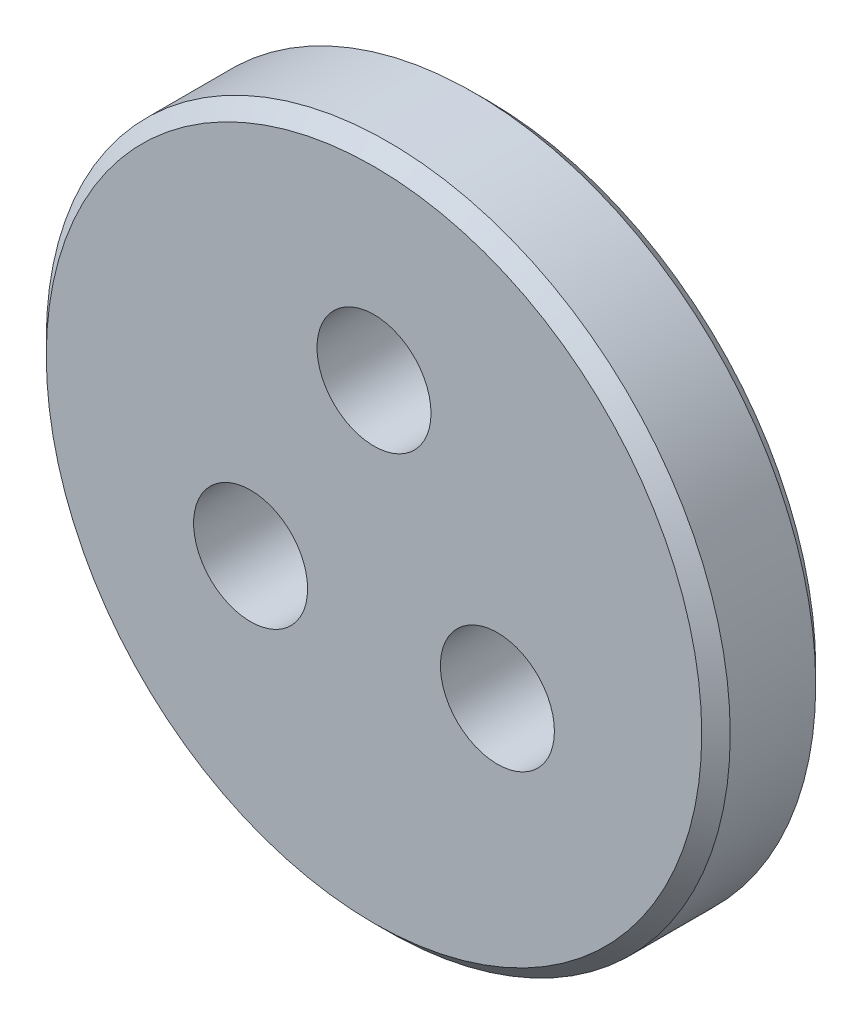
ISO-10303-21;
HEADER;
FILE_DESCRIPTION(('STEP AP214'),'2;1');
FILE_NAME('part.step','',(''),(''),'','','');
FILE_SCHEMA(('AUTOMOTIVE_DESIGN { 1 0 10303 214 1 1 1 1 }'));
ENDSEC;
DATA;
#1=APPLICATION_CONTEXT('core data for automotive mechanical design processes');
#2=APPLICATION_PROTOCOL_DEFINITION('international standard','automotive_design',2000,#1);
#3=PRODUCT_CONTEXT('',#1,'mechanical');
#4=PRODUCT('Part','Part','',(#3));
#5=PRODUCT_RELATED_PRODUCT_CATEGORY('part','',(#4));
#6=PRODUCT_DEFINITION_FORMATION('','',#4);
#7=PRODUCT_DEFINITION_CONTEXT('part definition',#1,'design');
#8=PRODUCT_DEFINITION('design','',#6,#7);
#9=PRODUCT_DEFINITION_SHAPE('','',#8);
#10=(LENGTH_UNIT() NAMED_UNIT(*) SI_UNIT(.MILLI.,.METRE.));
#11=(NAMED_UNIT(*) PLANE_ANGLE_UNIT() SI_UNIT($,.RADIAN.));
#12=(NAMED_UNIT(*) SI_UNIT($,.STERADIAN.) SOLID_ANGLE_UNIT());
#13=UNCERTAINTY_MEASURE_WITH_UNIT(LENGTH_MEASURE(1.E-05),#10,'distance_accuracy_value','');
#14=(GEOMETRIC_REPRESENTATION_CONTEXT(3) GLOBAL_UNCERTAINTY_ASSIGNED_CONTEXT((#13)) GLOBAL_UNIT_ASSIGNED_CONTEXT((#10,
#11,#12)) REPRESENTATION_CONTEXT('',''));
#15=CARTESIAN_POINT('',(0.,0.,0.));
#16=DIRECTION('',(0.,0.,1.));
#17=DIRECTION('',(1.,0.,0.));
#18=AXIS2_PLACEMENT_3D('',#15,#16,#17);
#19=CARTESIAN_POINT('',(0.,0.,4.));
#20=DIRECTION('',(0.,0.,1.));
#21=DIRECTION('',(1.,0.,0.));
#22=AXIS2_PLACEMENT_3D('',#19,#20,#21);
#23=PLANE('',#22);
#24=CARTESIAN_POINT('',(0.,0.,4.));
#25=DIRECTION('',(0.,0.,1.));
#26=DIRECTION('',(1.,0.,0.));
#27=AXIS2_PLACEMENT_3D('',#24,#25,#26);
#28=CIRCLE('',#27,11.5);
#29=CARTESIAN_POINT('',(11.5,0.,4.));
#30=VERTEX_POINT('',#29);
#31=EDGE_CURVE('E10',#30,#30,#28,.T.);
#32=ORIENTED_EDGE('',*,*,#31,.T.);
#33=EDGE_LOOP('',(#32));
#34=FACE_BOUND('',#33,.T.);
#35=CARTESIAN_POINT('',(4.33012701892218,-2.50000000000002,4.));
#36=DIRECTION('',(0.,0.,1.));
#37=DIRECTION('',(1.,0.,0.));
#38=AXIS2_PLACEMENT_3D('',#35,#36,#37);
#39=CIRCLE('',#38,2.);
#40=CARTESIAN_POINT('',(6.33012701892218,-2.50000000000002,4.));
#41=VERTEX_POINT('',#40);
#42=EDGE_CURVE('E66',#41,#41,#39,.T.);
#43=ORIENTED_EDGE('',*,*,#42,.F.);
#44=EDGE_LOOP('',(#43));
#45=FACE_BOUND('',#44,.T.);
#46=CARTESIAN_POINT('',(0.,5.,4.));
#47=DIRECTION('',(0.,0.,1.));
#48=DIRECTION('',(1.,0.,0.));
#49=AXIS2_PLACEMENT_3D('',#46,#47,#48);
#50=CIRCLE('',#49,2.);
#51=CARTESIAN_POINT('',(2.,5.,4.));
#52=VERTEX_POINT('',#51);
#53=EDGE_CURVE('E65',#52,#52,#50,.T.);
#54=ORIENTED_EDGE('',*,*,#53,.F.);
#55=EDGE_LOOP('',(#54));
#56=FACE_BOUND('',#55,.T.);
#57=CARTESIAN_POINT('',(-4.33012701892221,-2.49999999999996,4.));
#58=DIRECTION('',(0.,0.,1.));
#59=DIRECTION('',(1.,0.,0.));
#60=AXIS2_PLACEMENT_3D('',#57,#58,#59);
#61=CIRCLE('',#60,2.);
#62=CARTESIAN_POINT('',(-2.33012701892222,-2.49999999999996,4.));
#63=VERTEX_POINT('',#62);
#64=EDGE_CURVE('E74',#63,#63,#61,.T.);
#65=ORIENTED_EDGE('',*,*,#64,.F.);
#66=EDGE_LOOP('',(#65));
#67=FACE_BOUND('',#66,.T.);
#68=ADVANCED_FACE('F43',(#34,#45,#56,#67),#23,.T.);
#69=CARTESIAN_POINT('',(0.,0.,0.));
#70=DIRECTION('',(0.,0.,1.));
#71=DIRECTION('',(1.,0.,0.));
#72=AXIS2_PLACEMENT_3D('',#69,#70,#71);
#73=PLANE('',#72);
#74=CARTESIAN_POINT('',(0.,0.,0.));
#75=DIRECTION('',(0.,0.,1.));
#76=DIRECTION('',(1.,0.,0.));
#77=AXIS2_PLACEMENT_3D('',#74,#75,#76);
#78=CIRCLE('',#77,11.5);
#79=CARTESIAN_POINT('',(11.5,0.,0.));
#80=VERTEX_POINT('',#79);
#81=EDGE_CURVE('E51',#80,#80,#78,.F.);
#82=ORIENTED_EDGE('',*,*,#81,.T.);
#83=EDGE_LOOP('',(#82));
#84=FACE_BOUND('',#83,.T.);
#85=CARTESIAN_POINT('',(0.,5.,0.));
#86=DIRECTION('',(0.,0.,1.));
#87=DIRECTION('',(1.,0.,0.));
#88=AXIS2_PLACEMENT_3D('',#85,#86,#87);
#89=CIRCLE('',#88,2.);
#90=CARTESIAN_POINT('',(2.,5.,0.));
#91=VERTEX_POINT('',#90);
#92=EDGE_CURVE('E61',#91,#91,#89,.T.);
#93=ORIENTED_EDGE('',*,*,#92,.T.);
#94=EDGE_LOOP('',(#93));
#95=FACE_BOUND('',#94,.T.);
#96=CARTESIAN_POINT('',(4.33012701892218,-2.50000000000002,0.));
#97=DIRECTION('',(0.,0.,1.));
#98=DIRECTION('',(1.,0.,0.));
#99=AXIS2_PLACEMENT_3D('',#96,#97,#98);
#100=CIRCLE('',#99,2.);
#101=CARTESIAN_POINT('',(6.33012701892218,-2.50000000000002,0.));
#102=VERTEX_POINT('',#101);
#103=EDGE_CURVE('E72',#102,#102,#100,.T.);
#104=ORIENTED_EDGE('',*,*,#103,.T.);
#105=EDGE_LOOP('',(#104));
#106=FACE_BOUND('',#105,.T.);
#107=CARTESIAN_POINT('',(-4.33012701892221,-2.49999999999996,0.));
#108=DIRECTION('',(0.,0.,1.));
#109=DIRECTION('',(1.,0.,0.));
#110=AXIS2_PLACEMENT_3D('',#107,#108,#109);
#111=CIRCLE('',#110,2.);
#112=CARTESIAN_POINT('',(-2.33012701892222,-2.49999999999996,0.));
#113=VERTEX_POINT('',#112);
#114=EDGE_CURVE('E79',#113,#113,#111,.T.);
#115=ORIENTED_EDGE('',*,*,#114,.T.);
#116=EDGE_LOOP('',(#115));
#117=FACE_BOUND('',#116,.T.);
#118=ADVANCED_FACE('F87',(#84,#95,#106,#117),#73,.F.);
#119=CARTESIAN_POINT('',(0.,0.,4.));
#120=DIRECTION('',(0.,0.,-1.));
#121=DIRECTION('',(-1.,0.,0.));
#122=AXIS2_PLACEMENT_3D('',#119,#120,#121);
#123=CYLINDRICAL_SURFACE('',#122,12.);
#124=CARTESIAN_POINT('',(0.,0.,0.500000000000004));
#125=DIRECTION('',(0.,0.,1.));
#126=DIRECTION('',(1.,0.,0.));
#127=AXIS2_PLACEMENT_3D('',#124,#125,#126);
#128=CIRCLE('',#127,12.);
#129=CARTESIAN_POINT('',(12.,0.,0.500000000000004));
#130=VERTEX_POINT('',#129);
#131=EDGE_CURVE('E54',#130,#130,#128,.T.);
#132=ORIENTED_EDGE('',*,*,#131,.T.);
#133=EDGE_LOOP('',(#132));
#134=FACE_BOUND('',#133,.T.);
#135=CARTESIAN_POINT('',(0.,0.,3.5));
#136=DIRECTION('',(0.,0.,1.));
#137=DIRECTION('',(1.,0.,0.));
#138=AXIS2_PLACEMENT_3D('',#135,#136,#137);
#139=CIRCLE('',#138,12.);
#140=CARTESIAN_POINT('',(12.,0.,3.5));
#141=VERTEX_POINT('',#140);
#142=EDGE_CURVE('E56',#141,#141,#139,.F.);
#143=ORIENTED_EDGE('',*,*,#142,.T.);
#144=EDGE_LOOP('',(#143));
#145=FACE_BOUND('',#144,.T.);
#146=ADVANCED_FACE('F91',(#134,#145),#123,.T.);
#147=CARTESIAN_POINT('',(0.,5.,4.));
#148=DIRECTION('',(0.,0.,-1.));
#149=DIRECTION('',(-1.,0.,0.));
#150=AXIS2_PLACEMENT_3D('',#147,#148,#149);
#151=CYLINDRICAL_SURFACE('',#150,2.);
#152=ORIENTED_EDGE('',*,*,#53,.T.);
#153=EDGE_LOOP('',(#152));
#154=FACE_BOUND('',#153,.T.);
#155=ORIENTED_EDGE('',*,*,#92,.F.);
#156=EDGE_LOOP('',(#155));
#157=FACE_BOUND('',#156,.T.);
#158=ADVANCED_FACE('F100',(#154,#157),#151,.F.);
#159=CARTESIAN_POINT('',(4.33012701892218,-2.50000000000002,4.));
#160=DIRECTION('',(0.,0.,-1.));
#161=DIRECTION('',(-1.,0.,0.));
#162=AXIS2_PLACEMENT_3D('',#159,#160,#161);
#163=CYLINDRICAL_SURFACE('',#162,2.);
#164=ORIENTED_EDGE('',*,*,#42,.T.);
#165=EDGE_LOOP('',(#164));
#166=FACE_BOUND('',#165,.T.);
#167=ORIENTED_EDGE('',*,*,#103,.F.);
#168=EDGE_LOOP('',(#167));
#169=FACE_BOUND('',#168,.T.);
#170=ADVANCED_FACE('F115',(#166,#169),#163,.F.);
#171=CARTESIAN_POINT('',(-4.33012701892221,-2.49999999999996,4.));
#172=DIRECTION('',(0.,0.,-1.));
#173=DIRECTION('',(-1.,0.,0.));
#174=AXIS2_PLACEMENT_3D('',#171,#172,#173);
#175=CYLINDRICAL_SURFACE('',#174,2.);
#176=ORIENTED_EDGE('',*,*,#64,.T.);
#177=EDGE_LOOP('',(#176));
#178=FACE_BOUND('',#177,.T.);
#179=ORIENTED_EDGE('',*,*,#114,.F.);
#180=EDGE_LOOP('',(#179));
#181=FACE_BOUND('',#180,.T.);
#182=ADVANCED_FACE('F81',(#178,#181),#175,.F.);
#183=CARTESIAN_POINT('',(0.,0.,0.500000000000004));
#184=DIRECTION('',(0.,0.,1.));
#185=DIRECTION('',(1.,0.,0.));
#186=AXIS2_PLACEMENT_3D('',#183,#184,#185);
#187=CONICAL_SURFACE('',#186,12.,0.785398163397448);
#188=ORIENTED_EDGE('',*,*,#81,.F.);
#189=EDGE_LOOP('',(#188));
#190=FACE_BOUND('',#189,.T.);
#191=ORIENTED_EDGE('',*,*,#131,.F.);
#192=EDGE_LOOP('',(#191));
#193=FACE_BOUND('',#192,.T.);
#194=ADVANCED_FACE('F103',(#190,#193),#187,.T.);
#195=CARTESIAN_POINT('',(0.,0.,4.));
#196=DIRECTION('',(0.,0.,-1.));
#197=DIRECTION('',(-1.,0.,0.));
#198=AXIS2_PLACEMENT_3D('',#195,#196,#197);
#199=CONICAL_SURFACE('',#198,11.5,0.785398163397447);
#200=ORIENTED_EDGE('',*,*,#142,.F.);
#201=EDGE_LOOP('',(#200));
#202=FACE_BOUND('',#201,.T.);
#203=ORIENTED_EDGE('',*,*,#31,.F.);
#204=EDGE_LOOP('',(#203));
#205=FACE_BOUND('',#204,.T.);
#206=ADVANCED_FACE('F46',(#202,#205),#199,.T.);
#207=CLOSED_SHELL('',(#68,#118,#146,#158,#170,#182,#194,#206));
#208=MANIFOLD_SOLID_BREP('B2',#207);
#209=ADVANCED_BREP_SHAPE_REPRESENTATION('',(#18,#208),#14);
#210=SHAPE_DEFINITION_REPRESENTATION(#9,#209);
ENDSEC;
END-ISO-10303-21;
